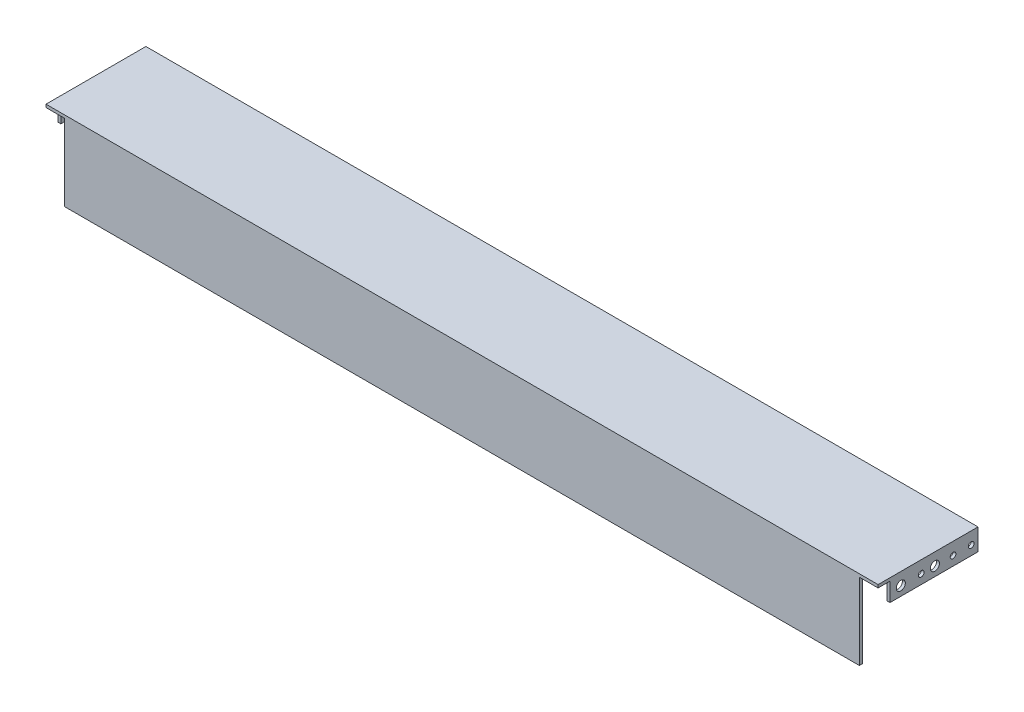
ISO-10303-21;
HEADER;
FILE_DESCRIPTION(('STEP AP214'),'2;1');
FILE_NAME('part.step','',(''),(''),'','','');
FILE_SCHEMA(('AUTOMOTIVE_DESIGN { 1 0 10303 214 1 1 1 1 }'));
ENDSEC;
DATA;
#1=APPLICATION_CONTEXT('core data for automotive mechanical design processes');
#2=APPLICATION_PROTOCOL_DEFINITION('international standard','automotive_design',2000,#1);
#3=PRODUCT_CONTEXT('',#1,'mechanical');
#4=PRODUCT('Part','Part','',(#3));
#5=PRODUCT_RELATED_PRODUCT_CATEGORY('part','',(#4));
#6=PRODUCT_DEFINITION_FORMATION('','',#4);
#7=PRODUCT_DEFINITION_CONTEXT('part definition',#1,'design');
#8=PRODUCT_DEFINITION('design','',#6,#7);
#9=PRODUCT_DEFINITION_SHAPE('','',#8);
#10=(LENGTH_UNIT() NAMED_UNIT(*) SI_UNIT(.MILLI.,.METRE.));
#11=(NAMED_UNIT(*) PLANE_ANGLE_UNIT() SI_UNIT($,.RADIAN.));
#12=(NAMED_UNIT(*) SI_UNIT($,.STERADIAN.) SOLID_ANGLE_UNIT());
#13=UNCERTAINTY_MEASURE_WITH_UNIT(LENGTH_MEASURE(1.E-05),#10,'distance_accuracy_value','');
#14=(GEOMETRIC_REPRESENTATION_CONTEXT(3) GLOBAL_UNCERTAINTY_ASSIGNED_CONTEXT((#13)) GLOBAL_UNIT_ASSIGNED_CONTEXT((#10,
#11,#12)) REPRESENTATION_CONTEXT('',''));
#15=CARTESIAN_POINT('',(0.,0.,0.));
#16=DIRECTION('',(0.,0.,1.));
#17=DIRECTION('',(1.,0.,0.));
#18=AXIS2_PLACEMENT_3D('',#15,#16,#17);
#19=CARTESIAN_POINT('',(350.,35.,-2.6));
#20=DIRECTION('',(1.,0.,0.));
#21=DIRECTION('',(0.,0.,-1.));
#22=AXIS2_PLACEMENT_3D('',#19,#20,#21);
#23=PLANE('',#22);
#24=DIRECTION('',(0.,1.,0.));
#25=VECTOR('',#24,1.);
#26=CARTESIAN_POINT('',(350.,35.,-2.6));
#27=LINE('',#26,#25);
#28=CARTESIAN_POINT('',(350.,-35.,-2.6));
#29=VERTEX_POINT('',#28);
#30=CARTESIAN_POINT('',(350.,32.4,-2.6));
#31=VERTEX_POINT('',#30);
#32=EDGE_CURVE('E89',#29,#31,#27,.T.);
#33=ORIENTED_EDGE('',*,*,#32,.T.);
#34=DIRECTION('',(0.,0.,1.));
#35=VECTOR('',#34,1.);
#36=CARTESIAN_POINT('',(350.,32.4,-2.6));
#37=LINE('',#36,#35);
#38=CARTESIAN_POINT('',(350.,32.4,0.));
#39=VERTEX_POINT('',#38);
#40=EDGE_CURVE('E78',#31,#39,#37,.T.);
#41=ORIENTED_EDGE('',*,*,#40,.T.);
#42=DIRECTION('',(0.,1.,0.));
#43=VECTOR('',#42,1.);
#44=CARTESIAN_POINT('',(350.,35.,0.));
#45=LINE('',#44,#43);
#46=CARTESIAN_POINT('',(350.,-35.,0.));
#47=VERTEX_POINT('',#46);
#48=EDGE_CURVE('E75',#47,#39,#45,.T.);
#49=ORIENTED_EDGE('',*,*,#48,.F.);
#50=DIRECTION('',(0.,0.,1.));
#51=VECTOR('',#50,1.);
#52=CARTESIAN_POINT('',(350.,-35.,-2.6));
#53=LINE('',#52,#51);
#54=EDGE_CURVE('E11',#29,#47,#53,.T.);
#55=ORIENTED_EDGE('',*,*,#54,.F.);
#56=EDGE_LOOP('',(#33,#41,#49,#55));
#57=FACE_BOUND('',#56,.T.);
#58=ADVANCED_FACE('F33',(#57),#23,.T.);
#59=CARTESIAN_POINT('',(-350.,35.,-2.6));
#60=DIRECTION('',(-1.,0.,0.));
#61=DIRECTION('',(0.,0.,1.));
#62=AXIS2_PLACEMENT_3D('',#59,#60,#61);
#63=PLANE('',#62);
#64=DIRECTION('',(0.,-1.,0.));
#65=VECTOR('',#64,1.);
#66=CARTESIAN_POINT('',(-350.,35.,0.));
#67=LINE('',#66,#65);
#68=CARTESIAN_POINT('',(-350.,32.4,0.));
#69=VERTEX_POINT('',#68);
#70=CARTESIAN_POINT('',(-350.,-35.,0.));
#71=VERTEX_POINT('',#70);
#72=EDGE_CURVE('E87',#69,#71,#67,.T.);
#73=ORIENTED_EDGE('',*,*,#72,.F.);
#74=DIRECTION('',(0.,0.,-1.));
#75=VECTOR('',#74,1.);
#76=CARTESIAN_POINT('',(-350.,32.4,-2.6));
#77=LINE('',#76,#75);
#78=CARTESIAN_POINT('',(-350.,32.4,-2.6));
#79=VERTEX_POINT('',#78);
#80=EDGE_CURVE('E99',#69,#79,#77,.T.);
#81=ORIENTED_EDGE('',*,*,#80,.T.);
#82=DIRECTION('',(0.,-1.,0.));
#83=VECTOR('',#82,1.);
#84=CARTESIAN_POINT('',(-350.,35.,-2.6));
#85=LINE('',#84,#83);
#86=CARTESIAN_POINT('',(-350.,-35.,-2.6));
#87=VERTEX_POINT('',#86);
#88=EDGE_CURVE('E91',#79,#87,#85,.T.);
#89=ORIENTED_EDGE('',*,*,#88,.T.);
#90=DIRECTION('',(0.,0.,1.));
#91=VECTOR('',#90,1.);
#92=CARTESIAN_POINT('',(-350.,-35.,-2.6));
#93=LINE('',#92,#91);
#94=EDGE_CURVE('E36',#87,#71,#93,.T.);
#95=ORIENTED_EDGE('',*,*,#94,.T.);
#96=EDGE_LOOP('',(#73,#81,#89,#95));
#97=FACE_BOUND('',#96,.T.);
#98=ADVANCED_FACE('F289',(#97),#63,.T.);
#99=CARTESIAN_POINT('',(0.,0.,-2.6));
#100=DIRECTION('',(0.,0.,1.));
#101=DIRECTION('',(1.,0.,0.));
#102=AXIS2_PLACEMENT_3D('',#99,#100,#101);
#103=PLANE('',#102);
#104=DIRECTION('',(-1.,0.,0.));
#105=VECTOR('',#104,1.);
#106=CARTESIAN_POINT('',(0.,32.4,-2.6));
#107=LINE('',#106,#105);
#108=EDGE_CURVE('E102',#31,#79,#107,.T.);
#109=ORIENTED_EDGE('',*,*,#108,.F.);
#110=ORIENTED_EDGE('',*,*,#32,.F.);
#111=DIRECTION('',(1.,0.,0.));
#112=VECTOR('',#111,1.);
#113=CARTESIAN_POINT('',(-350.,-35.,-2.6));
#114=LINE('',#113,#112);
#115=EDGE_CURVE('E72',#87,#29,#114,.T.);
#116=ORIENTED_EDGE('',*,*,#115,.F.);
#117=ORIENTED_EDGE('',*,*,#88,.F.);
#118=EDGE_LOOP('',(#109,#110,#116,#117));
#119=FACE_BOUND('',#118,.T.);
#120=ADVANCED_FACE('F293',(#119),#103,.F.);
#121=CARTESIAN_POINT('',(-350.,-35.,-2.6));
#122=DIRECTION('',(0.,-1.,0.));
#123=DIRECTION('',(0.,0.,-1.));
#124=AXIS2_PLACEMENT_3D('',#121,#122,#123);
#125=PLANE('',#124);
#126=DIRECTION('',(1.,0.,0.));
#127=VECTOR('',#126,1.);
#128=CARTESIAN_POINT('',(-350.,-35.,0.));
#129=LINE('',#128,#127);
#130=EDGE_CURVE('E70',#71,#47,#129,.T.);
#131=ORIENTED_EDGE('',*,*,#130,.F.);
#132=ORIENTED_EDGE('',*,*,#94,.F.);
#133=ORIENTED_EDGE('',*,*,#115,.T.);
#134=ORIENTED_EDGE('',*,*,#54,.T.);
#135=EDGE_LOOP('',(#131,#132,#133,#134));
#136=FACE_BOUND('',#135,.T.);
#137=ADVANCED_FACE('F67',(#136),#125,.T.);
#138=CARTESIAN_POINT('',(-350.,35.,-2.6));
#139=DIRECTION('',(0.,1.,0.));
#140=DIRECTION('',(-1.,0.,0.));
#141=AXIS2_PLACEMENT_3D('',#138,#139,#140);
#142=PLANE('',#141);
#143=DIRECTION('',(-1.,0.,0.));
#144=VECTOR('',#143,1.);
#145=CARTESIAN_POINT('',(-350.,35.,0.));
#146=LINE('',#145,#144);
#147=CARTESIAN_POINT('',(366.5,35.,0.));
#148=VERTEX_POINT('',#147);
#149=CARTESIAN_POINT('',(-366.5,35.,0.));
#150=VERTEX_POINT('',#149);
#151=EDGE_CURVE('E81',#148,#150,#146,.T.);
#152=ORIENTED_EDGE('',*,*,#151,.F.);
#153=DIRECTION('',(0.,0.,-1.));
#154=VECTOR('',#153,1.);
#155=CARTESIAN_POINT('',(366.5,35.,0.));
#156=LINE('',#155,#154);
#157=CARTESIAN_POINT('',(366.5,35.,-88.));
#158=VERTEX_POINT('',#157);
#159=EDGE_CURVE('E122',#148,#158,#156,.T.);
#160=ORIENTED_EDGE('',*,*,#159,.T.);
#161=DIRECTION('',(-1.,0.,0.));
#162=VECTOR('',#161,1.);
#163=CARTESIAN_POINT('',(366.5,35.,-88.));
#164=LINE('',#163,#162);
#165=CARTESIAN_POINT('',(-366.5,35.,-88.));
#166=VERTEX_POINT('',#165);
#167=EDGE_CURVE('E118',#158,#166,#164,.T.);
#168=ORIENTED_EDGE('',*,*,#167,.T.);
#169=DIRECTION('',(0.,0.,1.));
#170=VECTOR('',#169,1.);
#171=CARTESIAN_POINT('',(-366.5,35.,0.));
#172=LINE('',#171,#170);
#173=EDGE_CURVE('E125',#166,#150,#172,.T.);
#174=ORIENTED_EDGE('',*,*,#173,.T.);
#175=EDGE_LOOP('',(#152,#160,#168,#174));
#176=FACE_BOUND('',#175,.T.);
#177=ADVANCED_FACE('F303',(#176),#142,.T.);
#178=CARTESIAN_POINT('',(0.,0.,0.));
#179=DIRECTION('',(0.,0.,1.));
#180=DIRECTION('',(1.,0.,0.));
#181=AXIS2_PLACEMENT_3D('',#178,#179,#180);
#182=PLANE('',#181);
#183=ORIENTED_EDGE('',*,*,#151,.T.);
#184=DIRECTION('',(0.,1.,0.));
#185=VECTOR('',#184,1.);
#186=CARTESIAN_POINT('',(-366.5,32.4,0.));
#187=LINE('',#186,#185);
#188=CARTESIAN_POINT('',(-366.5,32.4,0.));
#189=VERTEX_POINT('',#188);
#190=EDGE_CURVE('E106',#189,#150,#187,.T.);
#191=ORIENTED_EDGE('',*,*,#190,.F.);
#192=DIRECTION('',(1.,0.,0.));
#193=VECTOR('',#192,1.);
#194=CARTESIAN_POINT('',(-366.5,32.4,0.));
#195=LINE('',#194,#193);
#196=EDGE_CURVE('E134',#189,#69,#195,.T.);
#197=ORIENTED_EDGE('',*,*,#196,.T.);
#198=ORIENTED_EDGE('',*,*,#72,.T.);
#199=ORIENTED_EDGE('',*,*,#130,.T.);
#200=ORIENTED_EDGE('',*,*,#48,.T.);
#201=CARTESIAN_POINT('',(366.5,32.4,0.));
#202=VERTEX_POINT('',#201);
#203=EDGE_CURVE('E136',#39,#202,#195,.T.);
#204=ORIENTED_EDGE('',*,*,#203,.T.);
#205=DIRECTION('',(0.,1.,0.));
#206=VECTOR('',#205,1.);
#207=CARTESIAN_POINT('',(366.5,32.4,0.));
#208=LINE('',#207,#206);
#209=EDGE_CURVE('E109',#202,#148,#208,.T.);
#210=ORIENTED_EDGE('',*,*,#209,.T.);
#211=EDGE_LOOP('',(#183,#191,#197,#198,#199,#200,#204,#210));
#212=FACE_BOUND('',#211,.T.);
#213=ADVANCED_FACE('F84',(#212),#182,.T.);
#214=CARTESIAN_POINT('',(-366.5,32.4,0.));
#215=DIRECTION('',(-1.,0.,0.));
#216=DIRECTION('',(0.,-1.,0.));
#217=AXIS2_PLACEMENT_3D('',#214,#215,#216);
#218=PLANE('',#217);
#219=ORIENTED_EDGE('',*,*,#173,.F.);
#220=DIRECTION('',(0.,1.,0.));
#221=VECTOR('',#220,1.);
#222=CARTESIAN_POINT('',(-366.5,32.4,-88.));
#223=LINE('',#222,#221);
#224=CARTESIAN_POINT('',(-366.5,16.,-88.));
#225=VERTEX_POINT('',#224);
#226=EDGE_CURVE('E105',#225,#166,#223,.T.);
#227=ORIENTED_EDGE('',*,*,#226,.F.);
#228=DIRECTION('',(0.,0.,1.));
#229=VECTOR('',#228,1.);
#230=CARTESIAN_POINT('',(-366.5,16.,-88.));
#231=LINE('',#230,#229);
#232=CARTESIAN_POINT('',(-366.5,16.,-10.5));
#233=VERTEX_POINT('',#232);
#234=EDGE_CURVE('E146',#225,#233,#231,.T.);
#235=ORIENTED_EDGE('',*,*,#234,.T.);
#236=DIRECTION('',(0.,1.,0.));
#237=VECTOR('',#236,1.);
#238=CARTESIAN_POINT('',(-366.5,32.4,-10.5));
#239=LINE('',#238,#237);
#240=CARTESIAN_POINT('',(-366.5,32.4,-10.5));
#241=VERTEX_POINT('',#240);
#242=EDGE_CURVE('E47',#233,#241,#239,.T.);
#243=ORIENTED_EDGE('',*,*,#242,.T.);
#244=DIRECTION('',(0.,0.,1.));
#245=VECTOR('',#244,1.);
#246=CARTESIAN_POINT('',(-366.5,32.4,0.));
#247=LINE('',#246,#245);
#248=EDGE_CURVE('E121',#241,#189,#247,.T.);
#249=ORIENTED_EDGE('',*,*,#248,.T.);
#250=ORIENTED_EDGE('',*,*,#190,.T.);
#251=EDGE_LOOP('',(#219,#227,#235,#243,#249,#250));
#252=FACE_BOUND('',#251,.T.);
#253=CARTESIAN_POINT('',(-366.5,24.2,-19.9999999999999));
#254=DIRECTION('',(-1.,0.,0.));
#255=DIRECTION('',(0.,-1.,0.));
#256=AXIS2_PLACEMENT_3D('',#253,#254,#255);
#257=CIRCLE('',#256,4.);
#258=CARTESIAN_POINT('',(-366.5,20.2,-19.9999999999999));
#259=VERTEX_POINT('',#258);
#260=EDGE_CURVE('E185',#259,#259,#257,.T.);
#261=ORIENTED_EDGE('',*,*,#260,.F.);
#262=EDGE_LOOP('',(#261));
#263=FACE_BOUND('',#262,.T.);
#264=CARTESIAN_POINT('',(-366.5,24.2,-38.));
#265=DIRECTION('',(-1.,0.,0.));
#266=DIRECTION('',(0.,-1.,0.));
#267=AXIS2_PLACEMENT_3D('',#264,#265,#266);
#268=CIRCLE('',#267,2.5);
#269=CARTESIAN_POINT('',(-366.5,21.7,-38.));
#270=VERTEX_POINT('',#269);
#271=EDGE_CURVE('E179',#270,#270,#268,.T.);
#272=ORIENTED_EDGE('',*,*,#271,.F.);
#273=EDGE_LOOP('',(#272));
#274=FACE_BOUND('',#273,.T.);
#275=CARTESIAN_POINT('',(-366.5,24.2,-50.));
#276=DIRECTION('',(-1.,0.,0.));
#277=DIRECTION('',(0.,-1.,0.));
#278=AXIS2_PLACEMENT_3D('',#275,#276,#277);
#279=CIRCLE('',#278,4.);
#280=CARTESIAN_POINT('',(-366.5,20.2,-50.));
#281=VERTEX_POINT('',#280);
#282=EDGE_CURVE('E173',#281,#281,#279,.T.);
#283=ORIENTED_EDGE('',*,*,#282,.F.);
#284=EDGE_LOOP('',(#283));
#285=FACE_BOUND('',#284,.T.);
#286=CARTESIAN_POINT('',(-366.5,24.2,-65.9999999999999));
#287=DIRECTION('',(-1.,0.,0.));
#288=DIRECTION('',(0.,-1.,0.));
#289=AXIS2_PLACEMENT_3D('',#286,#287,#288);
#290=CIRCLE('',#289,2.49999999999999);
#291=CARTESIAN_POINT('',(-366.5,21.7,-65.9999999999999));
#292=VERTEX_POINT('',#291);
#293=EDGE_CURVE('E167',#292,#292,#290,.T.);
#294=ORIENTED_EDGE('',*,*,#293,.F.);
#295=EDGE_LOOP('',(#294));
#296=FACE_BOUND('',#295,.T.);
#297=CARTESIAN_POINT('',(-366.5,24.2,-81.9999999999999));
#298=DIRECTION('',(-1.,0.,0.));
#299=DIRECTION('',(0.,-1.,0.));
#300=AXIS2_PLACEMENT_3D('',#297,#298,#299);
#301=CIRCLE('',#300,2.50000000000001);
#302=CARTESIAN_POINT('',(-366.5,21.7,-81.9999999999999));
#303=VERTEX_POINT('',#302);
#304=EDGE_CURVE('E161',#303,#303,#301,.T.);
#305=ORIENTED_EDGE('',*,*,#304,.F.);
#306=EDGE_LOOP('',(#305));
#307=FACE_BOUND('',#306,.T.);
#308=ADVANCED_FACE('F310',(#252,#263,#274,#285,#296,#307),#218,.T.);
#309=CARTESIAN_POINT('',(366.5,32.4,-88.));
#310=DIRECTION('',(0.,0.,-1.));
#311=DIRECTION('',(-1.,0.,0.));
#312=AXIS2_PLACEMENT_3D('',#309,#310,#311);
#313=PLANE('',#312);
#314=ORIENTED_EDGE('',*,*,#167,.F.);
#315=DIRECTION('',(0.,1.,0.));
#316=VECTOR('',#315,1.);
#317=CARTESIAN_POINT('',(366.5,32.4,-88.));
#318=LINE('',#317,#316);
#319=CARTESIAN_POINT('',(366.5,16.,-88.0000000000004));
#320=VERTEX_POINT('',#319);
#321=EDGE_CURVE('E113',#320,#158,#318,.T.);
#322=ORIENTED_EDGE('',*,*,#321,.F.);
#323=DIRECTION('',(1.,0.,0.));
#324=VECTOR('',#323,1.);
#325=CARTESIAN_POINT('',(363.9,16.,-88.0000000000004));
#326=LINE('',#325,#324);
#327=CARTESIAN_POINT('',(363.9,16.,-88.0000000000004));
#328=VERTEX_POINT('',#327);
#329=EDGE_CURVE('E188',#328,#320,#326,.T.);
#330=ORIENTED_EDGE('',*,*,#329,.F.);
#331=DIRECTION('',(0.,1.,0.));
#332=VECTOR('',#331,1.);
#333=CARTESIAN_POINT('',(363.9,16.,-88.0000000000004));
#334=LINE('',#333,#332);
#335=CARTESIAN_POINT('',(363.9,32.4,-88.0000000000004));
#336=VERTEX_POINT('',#335);
#337=EDGE_CURVE('E203',#328,#336,#334,.T.);
#338=ORIENTED_EDGE('',*,*,#337,.T.);
#339=DIRECTION('',(-1.,0.,0.));
#340=VECTOR('',#339,1.);
#341=CARTESIAN_POINT('',(366.5,32.4,-88.));
#342=LINE('',#341,#340);
#343=CARTESIAN_POINT('',(-363.9,32.4,-88.));
#344=VERTEX_POINT('',#343);
#345=EDGE_CURVE('E110',#336,#344,#342,.T.);
#346=ORIENTED_EDGE('',*,*,#345,.T.);
#347=DIRECTION('',(0.,-1.,0.));
#348=VECTOR('',#347,1.);
#349=CARTESIAN_POINT('',(-363.9,32.4,-88.));
#350=LINE('',#349,#348);
#351=CARTESIAN_POINT('',(-363.9,16.,-88.));
#352=VERTEX_POINT('',#351);
#353=EDGE_CURVE('E153',#344,#352,#350,.T.);
#354=ORIENTED_EDGE('',*,*,#353,.T.);
#355=DIRECTION('',(-1.,0.,0.));
#356=VECTOR('',#355,1.);
#357=CARTESIAN_POINT('',(-363.9,16.,-88.));
#358=LINE('',#357,#356);
#359=EDGE_CURVE('E140',#352,#225,#358,.T.);
#360=ORIENTED_EDGE('',*,*,#359,.T.);
#361=ORIENTED_EDGE('',*,*,#226,.T.);
#362=EDGE_LOOP('',(#314,#322,#330,#338,#346,#354,#360,#361));
#363=FACE_BOUND('',#362,.T.);
#364=ADVANCED_FACE('F262',(#363),#313,.T.);
#365=CARTESIAN_POINT('',(366.5,32.4,0.));
#366=DIRECTION('',(1.,0.,0.));
#367=DIRECTION('',(0.,0.,-1.));
#368=AXIS2_PLACEMENT_3D('',#365,#366,#367);
#369=PLANE('',#368);
#370=ORIENTED_EDGE('',*,*,#159,.F.);
#371=ORIENTED_EDGE('',*,*,#209,.F.);
#372=DIRECTION('',(0.,0.,-1.));
#373=VECTOR('',#372,1.);
#374=CARTESIAN_POINT('',(366.5,32.4,0.));
#375=LINE('',#374,#373);
#376=CARTESIAN_POINT('',(366.5,32.4,-10.5000000000004));
#377=VERTEX_POINT('',#376);
#378=EDGE_CURVE('E131',#202,#377,#375,.T.);
#379=ORIENTED_EDGE('',*,*,#378,.T.);
#380=DIRECTION('',(0.,-1.,0.));
#381=VECTOR('',#380,1.);
#382=CARTESIAN_POINT('',(366.5,32.4,-10.5000000000004));
#383=LINE('',#382,#381);
#384=CARTESIAN_POINT('',(366.5,16.,-10.5000000000004));
#385=VERTEX_POINT('',#384);
#386=EDGE_CURVE('E204',#377,#385,#383,.T.);
#387=ORIENTED_EDGE('',*,*,#386,.T.);
#388=DIRECTION('',(0.,0.,-1.));
#389=VECTOR('',#388,1.);
#390=CARTESIAN_POINT('',(366.5,16.,-10.5000000000004));
#391=LINE('',#390,#389);
#392=EDGE_CURVE('E200',#385,#320,#391,.T.);
#393=ORIENTED_EDGE('',*,*,#392,.T.);
#394=ORIENTED_EDGE('',*,*,#321,.T.);
#395=EDGE_LOOP('',(#370,#371,#379,#387,#393,#394));
#396=FACE_BOUND('',#395,.T.);
#397=CARTESIAN_POINT('',(366.5,24.2,-20.0000000000004));
#398=DIRECTION('',(1.,0.,0.));
#399=DIRECTION('',(0.,0.,-1.));
#400=AXIS2_PLACEMENT_3D('',#397,#398,#399);
#401=CIRCLE('',#400,4.);
#402=CARTESIAN_POINT('',(366.5,24.2,-24.0000000000004));
#403=VERTEX_POINT('',#402);
#404=EDGE_CURVE('E242',#403,#403,#401,.T.);
#405=ORIENTED_EDGE('',*,*,#404,.F.);
#406=EDGE_LOOP('',(#405));
#407=FACE_BOUND('',#406,.T.);
#408=CARTESIAN_POINT('',(366.5,24.2,-82.0000000000004));
#409=DIRECTION('',(1.,0.,0.));
#410=DIRECTION('',(0.,0.,-1.));
#411=AXIS2_PLACEMENT_3D('',#408,#409,#410);
#412=CIRCLE('',#411,2.50000000000001);
#413=CARTESIAN_POINT('',(366.5,24.2,-84.5000000000004));
#414=VERTEX_POINT('',#413);
#415=EDGE_CURVE('E236',#414,#414,#412,.T.);
#416=ORIENTED_EDGE('',*,*,#415,.F.);
#417=EDGE_LOOP('',(#416));
#418=FACE_BOUND('',#417,.T.);
#419=CARTESIAN_POINT('',(366.5,24.2,-66.0000000000004));
#420=DIRECTION('',(1.,0.,0.));
#421=DIRECTION('',(0.,0.,-1.));
#422=AXIS2_PLACEMENT_3D('',#419,#420,#421);
#423=CIRCLE('',#422,2.49999999999999);
#424=CARTESIAN_POINT('',(366.5,24.2,-68.5000000000004));
#425=VERTEX_POINT('',#424);
#426=EDGE_CURVE('E230',#425,#425,#423,.T.);
#427=ORIENTED_EDGE('',*,*,#426,.F.);
#428=EDGE_LOOP('',(#427));
#429=FACE_BOUND('',#428,.T.);
#430=CARTESIAN_POINT('',(366.5,24.2,-50.0000000000004));
#431=DIRECTION('',(1.,0.,0.));
#432=DIRECTION('',(0.,0.,-1.));
#433=AXIS2_PLACEMENT_3D('',#430,#431,#432);
#434=CIRCLE('',#433,4.);
#435=CARTESIAN_POINT('',(366.5,24.2,-54.0000000000004));
#436=VERTEX_POINT('',#435);
#437=EDGE_CURVE('E224',#436,#436,#434,.T.);
#438=ORIENTED_EDGE('',*,*,#437,.F.);
#439=EDGE_LOOP('',(#438));
#440=FACE_BOUND('',#439,.T.);
#441=CARTESIAN_POINT('',(366.5,24.2,-38.0000000000004));
#442=DIRECTION('',(1.,0.,0.));
#443=DIRECTION('',(0.,0.,-1.));
#444=AXIS2_PLACEMENT_3D('',#441,#442,#443);
#445=CIRCLE('',#444,2.5);
#446=CARTESIAN_POINT('',(366.5,24.2,-40.5000000000004));
#447=VERTEX_POINT('',#446);
#448=EDGE_CURVE('E218',#447,#447,#445,.T.);
#449=ORIENTED_EDGE('',*,*,#448,.F.);
#450=EDGE_LOOP('',(#449));
#451=FACE_BOUND('',#450,.T.);
#452=ADVANCED_FACE('F258',(#396,#407,#418,#429,#440,#451),#369,.T.);
#453=CARTESIAN_POINT('',(0.,32.4,0.));
#454=DIRECTION('',(0.,1.,0.));
#455=DIRECTION('',(-1.,0.,0.));
#456=AXIS2_PLACEMENT_3D('',#453,#454,#455);
#457=PLANE('',#456);
#458=DIRECTION('',(0.,0.,1.));
#459=VECTOR('',#458,1.);
#460=CARTESIAN_POINT('',(363.9,32.4,-88.0000000000004));
#461=LINE('',#460,#459);
#462=CARTESIAN_POINT('',(363.9,32.4,-10.5000000000004));
#463=VERTEX_POINT('',#462);
#464=EDGE_CURVE('E213',#336,#463,#461,.T.);
#465=ORIENTED_EDGE('',*,*,#464,.T.);
#466=DIRECTION('',(1.,0.,0.));
#467=VECTOR('',#466,1.);
#468=CARTESIAN_POINT('',(363.9,32.4,-10.5000000000004));
#469=LINE('',#468,#467);
#470=EDGE_CURVE('E191',#463,#377,#469,.T.);
#471=ORIENTED_EDGE('',*,*,#470,.T.);
#472=ORIENTED_EDGE('',*,*,#378,.F.);
#473=ORIENTED_EDGE('',*,*,#203,.F.);
#474=ORIENTED_EDGE('',*,*,#40,.F.);
#475=ORIENTED_EDGE('',*,*,#108,.T.);
#476=ORIENTED_EDGE('',*,*,#80,.F.);
#477=ORIENTED_EDGE('',*,*,#196,.F.);
#478=ORIENTED_EDGE('',*,*,#248,.F.);
#479=DIRECTION('',(-1.,0.,0.));
#480=VECTOR('',#479,1.);
#481=CARTESIAN_POINT('',(-363.9,32.4,-10.5));
#482=LINE('',#481,#480);
#483=CARTESIAN_POINT('',(-363.9,32.4,-10.5));
#484=VERTEX_POINT('',#483);
#485=EDGE_CURVE('E138',#484,#241,#482,.T.);
#486=ORIENTED_EDGE('',*,*,#485,.F.);
#487=DIRECTION('',(0.,0.,-1.));
#488=VECTOR('',#487,1.);
#489=CARTESIAN_POINT('',(-363.9,32.4,-88.));
#490=LINE('',#489,#488);
#491=EDGE_CURVE('E156',#484,#344,#490,.T.);
#492=ORIENTED_EDGE('',*,*,#491,.T.);
#493=ORIENTED_EDGE('',*,*,#345,.F.);
#494=EDGE_LOOP('',(#465,#471,#472,#473,#474,#475,#476,#477,#478,#486,#492,#493));
#495=FACE_BOUND('',#494,.T.);
#496=ADVANCED_FACE('F261',(#495),#457,.F.);
#497=CARTESIAN_POINT('',(-363.9,32.4,-10.5));
#498=DIRECTION('',(0.,0.,1.));
#499=DIRECTION('',(1.,0.,0.));
#500=AXIS2_PLACEMENT_3D('',#497,#498,#499);
#501=PLANE('',#500);
#502=ORIENTED_EDGE('',*,*,#242,.F.);
#503=DIRECTION('',(-1.,0.,0.));
#504=VECTOR('',#503,1.);
#505=CARTESIAN_POINT('',(-363.9,16.,-10.5));
#506=LINE('',#505,#504);
#507=CARTESIAN_POINT('',(-363.9,16.,-10.5));
#508=VERTEX_POINT('',#507);
#509=EDGE_CURVE('E128',#508,#233,#506,.T.);
#510=ORIENTED_EDGE('',*,*,#509,.F.);
#511=DIRECTION('',(0.,1.,0.));
#512=VECTOR('',#511,1.);
#513=CARTESIAN_POINT('',(-363.9,32.4,-10.5));
#514=LINE('',#513,#512);
#515=EDGE_CURVE('E148',#508,#484,#514,.T.);
#516=ORIENTED_EDGE('',*,*,#515,.T.);
#517=ORIENTED_EDGE('',*,*,#485,.T.);
#518=EDGE_LOOP('',(#502,#510,#516,#517));
#519=FACE_BOUND('',#518,.T.);
#520=ADVANCED_FACE('F420',(#519),#501,.T.);
#521=CARTESIAN_POINT('',(-363.9,16.,-88.));
#522=DIRECTION('',(0.,-1.,0.));
#523=DIRECTION('',(1.,0.,0.));
#524=AXIS2_PLACEMENT_3D('',#521,#522,#523);
#525=PLANE('',#524);
#526=ORIENTED_EDGE('',*,*,#234,.F.);
#527=ORIENTED_EDGE('',*,*,#359,.F.);
#528=DIRECTION('',(0.,0.,1.));
#529=VECTOR('',#528,1.);
#530=CARTESIAN_POINT('',(-363.9,16.,-88.));
#531=LINE('',#530,#529);
#532=EDGE_CURVE('E141',#352,#508,#531,.T.);
#533=ORIENTED_EDGE('',*,*,#532,.T.);
#534=ORIENTED_EDGE('',*,*,#509,.T.);
#535=EDGE_LOOP('',(#526,#527,#533,#534));
#536=FACE_BOUND('',#535,.T.);
#537=ADVANCED_FACE('F416',(#536),#525,.T.);
#538=CARTESIAN_POINT('',(-363.9,0.,0.));
#539=DIRECTION('',(-1.,0.,0.));
#540=DIRECTION('',(0.,0.,1.));
#541=AXIS2_PLACEMENT_3D('',#538,#539,#540);
#542=PLANE('',#541);
#543=CARTESIAN_POINT('',(-363.9,24.2,-19.9999999999999));
#544=DIRECTION('',(-1.,0.,0.));
#545=DIRECTION('',(0.,-1.,0.));
#546=AXIS2_PLACEMENT_3D('',#543,#544,#545);
#547=CIRCLE('',#546,4.);
#548=CARTESIAN_POINT('',(-363.9,20.2,-19.9999999999999));
#549=VERTEX_POINT('',#548);
#550=EDGE_CURVE('E182',#549,#549,#547,.T.);
#551=ORIENTED_EDGE('',*,*,#550,.T.);
#552=EDGE_LOOP('',(#551));
#553=FACE_BOUND('',#552,.T.);
#554=CARTESIAN_POINT('',(-363.9,24.2,-38.));
#555=DIRECTION('',(-1.,0.,0.));
#556=DIRECTION('',(0.,-1.,0.));
#557=AXIS2_PLACEMENT_3D('',#554,#555,#556);
#558=CIRCLE('',#557,2.5);
#559=CARTESIAN_POINT('',(-363.9,21.7,-38.));
#560=VERTEX_POINT('',#559);
#561=EDGE_CURVE('E176',#560,#560,#558,.T.);
#562=ORIENTED_EDGE('',*,*,#561,.T.);
#563=EDGE_LOOP('',(#562));
#564=FACE_BOUND('',#563,.T.);
#565=CARTESIAN_POINT('',(-363.9,24.2,-50.));
#566=DIRECTION('',(-1.,0.,0.));
#567=DIRECTION('',(0.,-1.,0.));
#568=AXIS2_PLACEMENT_3D('',#565,#566,#567);
#569=CIRCLE('',#568,4.);
#570=CARTESIAN_POINT('',(-363.9,20.2,-50.));
#571=VERTEX_POINT('',#570);
#572=EDGE_CURVE('E170',#571,#571,#569,.T.);
#573=ORIENTED_EDGE('',*,*,#572,.T.);
#574=EDGE_LOOP('',(#573));
#575=FACE_BOUND('',#574,.T.);
#576=CARTESIAN_POINT('',(-363.9,24.2,-65.9999999999999));
#577=DIRECTION('',(-1.,0.,0.));
#578=DIRECTION('',(0.,-1.,0.));
#579=AXIS2_PLACEMENT_3D('',#576,#577,#578);
#580=CIRCLE('',#579,2.49999999999999);
#581=CARTESIAN_POINT('',(-363.9,21.7,-65.9999999999999));
#582=VERTEX_POINT('',#581);
#583=EDGE_CURVE('E164',#582,#582,#580,.T.);
#584=ORIENTED_EDGE('',*,*,#583,.T.);
#585=EDGE_LOOP('',(#584));
#586=FACE_BOUND('',#585,.T.);
#587=CARTESIAN_POINT('',(-363.9,24.2,-81.9999999999999));
#588=DIRECTION('',(-1.,0.,0.));
#589=DIRECTION('',(0.,-1.,0.));
#590=AXIS2_PLACEMENT_3D('',#587,#588,#589);
#591=CIRCLE('',#590,2.50000000000001);
#592=CARTESIAN_POINT('',(-363.9,21.7,-81.9999999999999));
#593=VERTEX_POINT('',#592);
#594=EDGE_CURVE('E150',#593,#593,#591,.T.);
#595=ORIENTED_EDGE('',*,*,#594,.T.);
#596=EDGE_LOOP('',(#595));
#597=FACE_BOUND('',#596,.T.);
#598=ORIENTED_EDGE('',*,*,#515,.F.);
#599=ORIENTED_EDGE('',*,*,#532,.F.);
#600=ORIENTED_EDGE('',*,*,#353,.F.);
#601=ORIENTED_EDGE('',*,*,#491,.F.);
#602=EDGE_LOOP('',(#598,#599,#600,#601));
#603=FACE_BOUND('',#602,.T.);
#604=ADVANCED_FACE('F412',(#553,#564,#575,#586,#597,#603),#542,.F.);
#605=CARTESIAN_POINT('',(-363.9,24.2,-81.9999999999999));
#606=DIRECTION('',(-1.,0.,0.));
#607=DIRECTION('',(0.,-1.,0.));
#608=AXIS2_PLACEMENT_3D('',#605,#606,#607);
#609=CYLINDRICAL_SURFACE('',#608,2.50000000000001);
#610=ORIENTED_EDGE('',*,*,#594,.F.);
#611=EDGE_LOOP('',(#610));
#612=FACE_BOUND('',#611,.T.);
#613=ORIENTED_EDGE('',*,*,#304,.T.);
#614=EDGE_LOOP('',(#613));
#615=FACE_BOUND('',#614,.T.);
#616=ADVANCED_FACE('F408',(#612,#615),#609,.F.);
#617=CARTESIAN_POINT('',(-363.9,24.2,-65.9999999999999));
#618=DIRECTION('',(-1.,0.,0.));
#619=DIRECTION('',(0.,-1.,0.));
#620=AXIS2_PLACEMENT_3D('',#617,#618,#619);
#621=CYLINDRICAL_SURFACE('',#620,2.49999999999999);
#622=ORIENTED_EDGE('',*,*,#583,.F.);
#623=EDGE_LOOP('',(#622));
#624=FACE_BOUND('',#623,.T.);
#625=ORIENTED_EDGE('',*,*,#293,.T.);
#626=EDGE_LOOP('',(#625));
#627=FACE_BOUND('',#626,.T.);
#628=ADVANCED_FACE('F404',(#624,#627),#621,.F.);
#629=CARTESIAN_POINT('',(-363.9,24.2,-50.));
#630=DIRECTION('',(-1.,0.,0.));
#631=DIRECTION('',(0.,-1.,0.));
#632=AXIS2_PLACEMENT_3D('',#629,#630,#631);
#633=CYLINDRICAL_SURFACE('',#632,4.);
#634=ORIENTED_EDGE('',*,*,#572,.F.);
#635=EDGE_LOOP('',(#634));
#636=FACE_BOUND('',#635,.T.);
#637=ORIENTED_EDGE('',*,*,#282,.T.);
#638=EDGE_LOOP('',(#637));
#639=FACE_BOUND('',#638,.T.);
#640=ADVANCED_FACE('F400',(#636,#639),#633,.F.);
#641=CARTESIAN_POINT('',(-363.9,24.2,-38.));
#642=DIRECTION('',(-1.,0.,0.));
#643=DIRECTION('',(0.,-1.,0.));
#644=AXIS2_PLACEMENT_3D('',#641,#642,#643);
#645=CYLINDRICAL_SURFACE('',#644,2.5);
#646=ORIENTED_EDGE('',*,*,#561,.F.);
#647=EDGE_LOOP('',(#646));
#648=FACE_BOUND('',#647,.T.);
#649=ORIENTED_EDGE('',*,*,#271,.T.);
#650=EDGE_LOOP('',(#649));
#651=FACE_BOUND('',#650,.T.);
#652=ADVANCED_FACE('F396',(#648,#651),#645,.F.);
#653=CARTESIAN_POINT('',(-363.9,24.2,-19.9999999999999));
#654=DIRECTION('',(-1.,0.,0.));
#655=DIRECTION('',(0.,-1.,0.));
#656=AXIS2_PLACEMENT_3D('',#653,#654,#655);
#657=CYLINDRICAL_SURFACE('',#656,4.);
#658=ORIENTED_EDGE('',*,*,#550,.F.);
#659=EDGE_LOOP('',(#658));
#660=FACE_BOUND('',#659,.T.);
#661=ORIENTED_EDGE('',*,*,#260,.T.);
#662=EDGE_LOOP('',(#661));
#663=FACE_BOUND('',#662,.T.);
#664=ADVANCED_FACE('F391',(#660,#663),#657,.F.);
#665=CARTESIAN_POINT('',(363.9,16.,-10.5000000000004));
#666=DIRECTION('',(0.,-1.,0.));
#667=DIRECTION('',(1.,0.,0.));
#668=AXIS2_PLACEMENT_3D('',#665,#666,#667);
#669=PLANE('',#668);
#670=ORIENTED_EDGE('',*,*,#392,.F.);
#671=DIRECTION('',(1.,0.,0.));
#672=VECTOR('',#671,1.);
#673=CARTESIAN_POINT('',(363.9,16.,-10.5000000000004));
#674=LINE('',#673,#672);
#675=CARTESIAN_POINT('',(363.9,16.,-10.5000000000004));
#676=VERTEX_POINT('',#675);
#677=EDGE_CURVE('E194',#676,#385,#674,.T.);
#678=ORIENTED_EDGE('',*,*,#677,.F.);
#679=DIRECTION('',(0.,0.,-1.));
#680=VECTOR('',#679,1.);
#681=CARTESIAN_POINT('',(363.9,16.,-10.5000000000004));
#682=LINE('',#681,#680);
#683=EDGE_CURVE('E195',#676,#328,#682,.T.);
#684=ORIENTED_EDGE('',*,*,#683,.T.);
#685=ORIENTED_EDGE('',*,*,#329,.T.);
#686=EDGE_LOOP('',(#670,#678,#684,#685));
#687=FACE_BOUND('',#686,.T.);
#688=ADVANCED_FACE('F337',(#687),#669,.T.);
#689=CARTESIAN_POINT('',(363.9,32.4,-10.5000000000004));
#690=DIRECTION('',(0.,0.,1.));
#691=DIRECTION('',(1.,0.,0.));
#692=AXIS2_PLACEMENT_3D('',#689,#690,#691);
#693=PLANE('',#692);
#694=ORIENTED_EDGE('',*,*,#386,.F.);
#695=ORIENTED_EDGE('',*,*,#470,.F.);
#696=DIRECTION('',(0.,-1.,0.));
#697=VECTOR('',#696,1.);
#698=CARTESIAN_POINT('',(363.9,32.4,-10.5000000000004));
#699=LINE('',#698,#697);
#700=EDGE_CURVE('E210',#463,#676,#699,.T.);
#701=ORIENTED_EDGE('',*,*,#700,.T.);
#702=ORIENTED_EDGE('',*,*,#677,.T.);
#703=EDGE_LOOP('',(#694,#695,#701,#702));
#704=FACE_BOUND('',#703,.T.);
#705=ADVANCED_FACE('F285',(#704),#693,.T.);
#706=CARTESIAN_POINT('',(363.9,0.,-2.60873922659447E-13));
#707=DIRECTION('',(1.,0.,0.));
#708=DIRECTION('',(0.,0.,-1.));
#709=AXIS2_PLACEMENT_3D('',#706,#707,#708);
#710=PLANE('',#709);
#711=CARTESIAN_POINT('',(363.9,24.2,-20.0000000000004));
#712=DIRECTION('',(1.,0.,0.));
#713=DIRECTION('',(0.,0.,-1.));
#714=AXIS2_PLACEMENT_3D('',#711,#712,#713);
#715=CIRCLE('',#714,4.);
#716=CARTESIAN_POINT('',(363.9,24.2,-24.0000000000004));
#717=VERTEX_POINT('',#716);
#718=EDGE_CURVE('E239',#717,#717,#715,.T.);
#719=ORIENTED_EDGE('',*,*,#718,.T.);
#720=EDGE_LOOP('',(#719));
#721=FACE_BOUND('',#720,.T.);
#722=CARTESIAN_POINT('',(363.9,24.2,-82.0000000000004));
#723=DIRECTION('',(1.,0.,0.));
#724=DIRECTION('',(0.,0.,-1.));
#725=AXIS2_PLACEMENT_3D('',#722,#723,#724);
#726=CIRCLE('',#725,2.50000000000001);
#727=CARTESIAN_POINT('',(363.9,24.2,-84.5000000000004));
#728=VERTEX_POINT('',#727);
#729=EDGE_CURVE('E233',#728,#728,#726,.T.);
#730=ORIENTED_EDGE('',*,*,#729,.T.);
#731=EDGE_LOOP('',(#730));
#732=FACE_BOUND('',#731,.T.);
#733=CARTESIAN_POINT('',(363.9,24.2,-66.0000000000004));
#734=DIRECTION('',(1.,0.,0.));
#735=DIRECTION('',(0.,0.,-1.));
#736=AXIS2_PLACEMENT_3D('',#733,#734,#735);
#737=CIRCLE('',#736,2.49999999999999);
#738=CARTESIAN_POINT('',(363.9,24.2,-68.5000000000004));
#739=VERTEX_POINT('',#738);
#740=EDGE_CURVE('E227',#739,#739,#737,.T.);
#741=ORIENTED_EDGE('',*,*,#740,.T.);
#742=EDGE_LOOP('',(#741));
#743=FACE_BOUND('',#742,.T.);
#744=CARTESIAN_POINT('',(363.9,24.2,-50.0000000000004));
#745=DIRECTION('',(1.,0.,0.));
#746=DIRECTION('',(0.,0.,-1.));
#747=AXIS2_PLACEMENT_3D('',#744,#745,#746);
#748=CIRCLE('',#747,4.);
#749=CARTESIAN_POINT('',(363.9,24.2,-54.0000000000004));
#750=VERTEX_POINT('',#749);
#751=EDGE_CURVE('E221',#750,#750,#748,.T.);
#752=ORIENTED_EDGE('',*,*,#751,.T.);
#753=EDGE_LOOP('',(#752));
#754=FACE_BOUND('',#753,.T.);
#755=CARTESIAN_POINT('',(363.9,24.2,-38.0000000000004));
#756=DIRECTION('',(1.,0.,0.));
#757=DIRECTION('',(0.,0.,-1.));
#758=AXIS2_PLACEMENT_3D('',#755,#756,#757);
#759=CIRCLE('',#758,2.5);
#760=CARTESIAN_POINT('',(363.9,24.2,-40.5000000000004));
#761=VERTEX_POINT('',#760);
#762=EDGE_CURVE('E207',#761,#761,#759,.T.);
#763=ORIENTED_EDGE('',*,*,#762,.T.);
#764=EDGE_LOOP('',(#763));
#765=FACE_BOUND('',#764,.T.);
#766=ORIENTED_EDGE('',*,*,#337,.F.);
#767=ORIENTED_EDGE('',*,*,#683,.F.);
#768=ORIENTED_EDGE('',*,*,#700,.F.);
#769=ORIENTED_EDGE('',*,*,#464,.F.);
#770=EDGE_LOOP('',(#766,#767,#768,#769));
#771=FACE_BOUND('',#770,.T.);
#772=ADVANCED_FACE('F248',(#721,#732,#743,#754,#765,#771),#710,.F.);
#773=CARTESIAN_POINT('',(363.9,24.2,-38.0000000000004));
#774=DIRECTION('',(1.,0.,0.));
#775=DIRECTION('',(0.,0.,-1.));
#776=AXIS2_PLACEMENT_3D('',#773,#774,#775);
#777=CYLINDRICAL_SURFACE('',#776,2.5);
#778=ORIENTED_EDGE('',*,*,#762,.F.);
#779=EDGE_LOOP('',(#778));
#780=FACE_BOUND('',#779,.T.);
#781=ORIENTED_EDGE('',*,*,#448,.T.);
#782=EDGE_LOOP('',(#781));
#783=FACE_BOUND('',#782,.T.);
#784=ADVANCED_FACE('F273',(#780,#783),#777,.F.);
#785=CARTESIAN_POINT('',(363.9,24.2,-50.0000000000004));
#786=DIRECTION('',(1.,0.,0.));
#787=DIRECTION('',(0.,0.,-1.));
#788=AXIS2_PLACEMENT_3D('',#785,#786,#787);
#789=CYLINDRICAL_SURFACE('',#788,4.);
#790=ORIENTED_EDGE('',*,*,#751,.F.);
#791=EDGE_LOOP('',(#790));
#792=FACE_BOUND('',#791,.T.);
#793=ORIENTED_EDGE('',*,*,#437,.T.);
#794=EDGE_LOOP('',(#793));
#795=FACE_BOUND('',#794,.T.);
#796=ADVANCED_FACE('F275',(#792,#795),#789,.F.);
#797=CARTESIAN_POINT('',(363.9,24.2,-66.0000000000004));
#798=DIRECTION('',(1.,0.,0.));
#799=DIRECTION('',(0.,0.,-1.));
#800=AXIS2_PLACEMENT_3D('',#797,#798,#799);
#801=CYLINDRICAL_SURFACE('',#800,2.49999999999999);
#802=ORIENTED_EDGE('',*,*,#740,.F.);
#803=EDGE_LOOP('',(#802));
#804=FACE_BOUND('',#803,.T.);
#805=ORIENTED_EDGE('',*,*,#426,.T.);
#806=EDGE_LOOP('',(#805));
#807=FACE_BOUND('',#806,.T.);
#808=ADVANCED_FACE('F282',(#804,#807),#801,.F.);
#809=CARTESIAN_POINT('',(363.9,24.2,-82.0000000000004));
#810=DIRECTION('',(1.,0.,0.));
#811=DIRECTION('',(0.,0.,-1.));
#812=AXIS2_PLACEMENT_3D('',#809,#810,#811);
#813=CYLINDRICAL_SURFACE('',#812,2.50000000000001);
#814=ORIENTED_EDGE('',*,*,#729,.F.);
#815=EDGE_LOOP('',(#814));
#816=FACE_BOUND('',#815,.T.);
#817=ORIENTED_EDGE('',*,*,#415,.T.);
#818=EDGE_LOOP('',(#817));
#819=FACE_BOUND('',#818,.T.);
#820=ADVANCED_FACE('F254',(#816,#819),#813,.F.);
#821=CARTESIAN_POINT('',(363.9,24.2,-20.0000000000004));
#822=DIRECTION('',(1.,0.,0.));
#823=DIRECTION('',(0.,0.,-1.));
#824=AXIS2_PLACEMENT_3D('',#821,#822,#823);
#825=CYLINDRICAL_SURFACE('',#824,4.);
#826=ORIENTED_EDGE('',*,*,#718,.F.);
#827=EDGE_LOOP('',(#826));
#828=FACE_BOUND('',#827,.T.);
#829=ORIENTED_EDGE('',*,*,#404,.T.);
#830=EDGE_LOOP('',(#829));
#831=FACE_BOUND('',#830,.T.);
#832=ADVANCED_FACE('F251',(#828,#831),#825,.F.);
#833=CLOSED_SHELL('',(#58,#98,#120,#137,#177,#213,#308,#364,#452,#496,#520,#537,#604,#616,#628,
#640,#652,#664,#688,#705,#772,#784,#796,#808,#820,#832));
#834=MANIFOLD_SOLID_BREP('B2',#833);
#835=ADVANCED_BREP_SHAPE_REPRESENTATION('',(#18,#834),#14);
#836=SHAPE_DEFINITION_REPRESENTATION(#9,#835);
ENDSEC;
END-ISO-10303-21;
